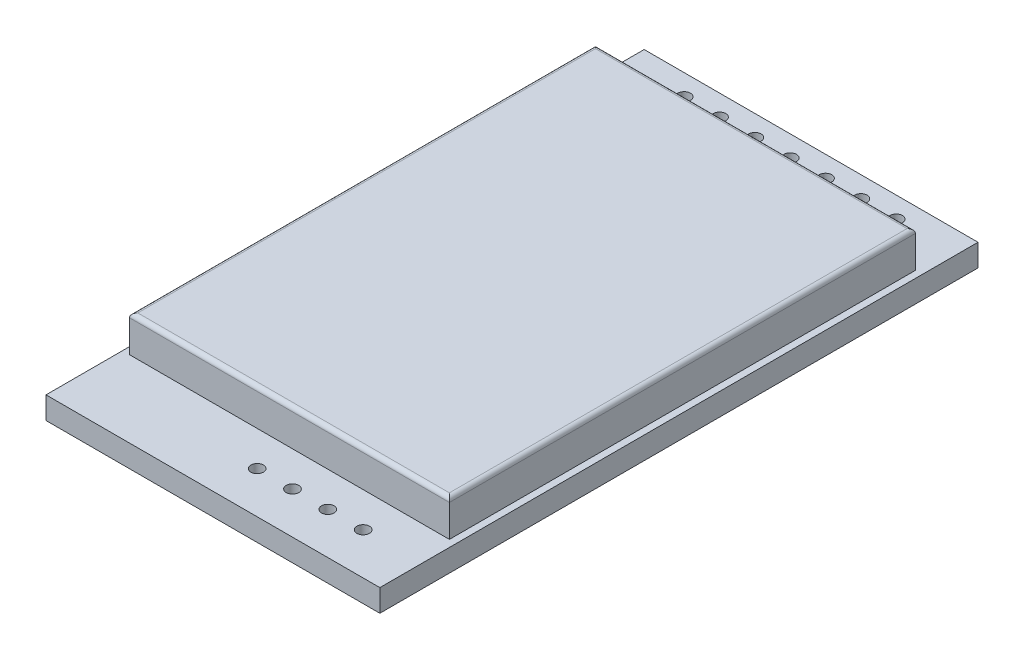
ISO-10303-21;
HEADER;
FILE_DESCRIPTION(('STEP AP214'),'2;1');
FILE_NAME('part.step','',(''),(''),'','','');
FILE_SCHEMA(('AUTOMOTIVE_DESIGN { 1 0 10303 214 1 1 1 1 }'));
ENDSEC;
DATA;
#1=APPLICATION_CONTEXT('core data for automotive mechanical design processes');
#2=APPLICATION_PROTOCOL_DEFINITION('international standard','automotive_design',2000,#1);
#3=PRODUCT_CONTEXT('',#1,'mechanical');
#4=PRODUCT('Part','Part','',(#3));
#5=PRODUCT_RELATED_PRODUCT_CATEGORY('part','',(#4));
#6=PRODUCT_DEFINITION_FORMATION('','',#4);
#7=PRODUCT_DEFINITION_CONTEXT('part definition',#1,'design');
#8=PRODUCT_DEFINITION('design','',#6,#7);
#9=PRODUCT_DEFINITION_SHAPE('','',#8);
#10=(LENGTH_UNIT() NAMED_UNIT(*) SI_UNIT(.MILLI.,.METRE.));
#11=(NAMED_UNIT(*) PLANE_ANGLE_UNIT() SI_UNIT($,.RADIAN.));
#12=(NAMED_UNIT(*) SI_UNIT($,.STERADIAN.) SOLID_ANGLE_UNIT());
#13=UNCERTAINTY_MEASURE_WITH_UNIT(LENGTH_MEASURE(1.E-05),#10,'distance_accuracy_value','');
#14=(GEOMETRIC_REPRESENTATION_CONTEXT(3) GLOBAL_UNCERTAINTY_ASSIGNED_CONTEXT((#13)) GLOBAL_UNIT_ASSIGNED_CONTEXT((#10,
#11,#12)) REPRESENTATION_CONTEXT('',''));
#15=CARTESIAN_POINT('',(0.,0.,0.));
#16=DIRECTION('',(0.,0.,1.));
#17=DIRECTION('',(1.,0.,0.));
#18=AXIS2_PLACEMENT_3D('',#15,#16,#17);
#19=CARTESIAN_POINT('',(0.,1.6,0.));
#20=DIRECTION('',(0.,-1.,0.));
#21=DIRECTION('',(0.,0.,-1.));
#22=AXIS2_PLACEMENT_3D('',#19,#20,#21);
#23=PLANE('',#22);
#24=CARTESIAN_POINT('',(12.18,1.6,-3.));
#25=DIRECTION('',(0.,1.,0.));
#26=DIRECTION('',(0.,0.,1.));
#27=AXIS2_PLACEMENT_3D('',#24,#25,#26);
#28=CIRCLE('',#27,0.449999999999998);
#29=CARTESIAN_POINT('',(12.18,1.6,-2.55));
#30=VERTEX_POINT('',#29);
#31=EDGE_CURVE('E139',#30,#30,#28,.T.);
#32=ORIENTED_EDGE('',*,*,#31,.F.);
#33=EDGE_LOOP('',(#32));
#34=FACE_BOUND('',#33,.T.);
#35=CARTESIAN_POINT('',(14.72,1.6,-3.));
#36=DIRECTION('',(0.,1.,0.));
#37=DIRECTION('',(0.,0.,1.));
#38=AXIS2_PLACEMENT_3D('',#35,#36,#37);
#39=CIRCLE('',#38,0.449999999999998);
#40=CARTESIAN_POINT('',(14.72,1.6,-2.55));
#41=VERTEX_POINT('',#40);
#42=EDGE_CURVE('E145',#41,#41,#39,.T.);
#43=ORIENTED_EDGE('',*,*,#42,.F.);
#44=EDGE_LOOP('',(#43));
#45=FACE_BOUND('',#44,.T.);
#46=CARTESIAN_POINT('',(17.26,1.6,-3.));
#47=DIRECTION('',(0.,1.,0.));
#48=DIRECTION('',(0.,0.,1.));
#49=AXIS2_PLACEMENT_3D('',#46,#47,#48);
#50=CIRCLE('',#49,0.449999999999998);
#51=CARTESIAN_POINT('',(17.26,1.6,-2.55));
#52=VERTEX_POINT('',#51);
#53=EDGE_CURVE('E151',#52,#52,#50,.T.);
#54=ORIENTED_EDGE('',*,*,#53,.F.);
#55=EDGE_LOOP('',(#54));
#56=FACE_BOUND('',#55,.T.);
#57=CARTESIAN_POINT('',(19.8,1.6,-3.));
#58=DIRECTION('',(0.,1.,0.));
#59=DIRECTION('',(0.,0.,1.));
#60=AXIS2_PLACEMENT_3D('',#57,#58,#59);
#61=CIRCLE('',#60,0.449999999999998);
#62=CARTESIAN_POINT('',(19.8,1.6,-2.55));
#63=VERTEX_POINT('',#62);
#64=EDGE_CURVE('E157',#63,#63,#61,.T.);
#65=ORIENTED_EDGE('',*,*,#64,.F.);
#66=EDGE_LOOP('',(#65));
#67=FACE_BOUND('',#66,.T.);
#68=CARTESIAN_POINT('',(4.38000000000029,1.6,-41.4999999999999));
#69=DIRECTION('',(0.,1.,0.));
#70=DIRECTION('',(0.,0.,1.));
#71=AXIS2_PLACEMENT_3D('',#68,#69,#70);
#72=CIRCLE('',#71,0.449999999999724);
#73=CARTESIAN_POINT('',(4.38000000000029,1.6,-41.0500000000001));
#74=VERTEX_POINT('',#73);
#75=EDGE_CURVE('E163',#74,#74,#72,.T.);
#76=ORIENTED_EDGE('',*,*,#75,.F.);
#77=EDGE_LOOP('',(#76));
#78=FACE_BOUND('',#77,.T.);
#79=CARTESIAN_POINT('',(6.92000000000029,1.6,-41.4999999999999));
#80=DIRECTION('',(0.,1.,0.));
#81=DIRECTION('',(0.,0.,1.));
#82=AXIS2_PLACEMENT_3D('',#79,#80,#81);
#83=CIRCLE('',#82,0.44999999999973);
#84=CARTESIAN_POINT('',(6.92000000000029,1.6,-41.0500000000001));
#85=VERTEX_POINT('',#84);
#86=EDGE_CURVE('E169',#85,#85,#83,.T.);
#87=ORIENTED_EDGE('',*,*,#86,.F.);
#88=EDGE_LOOP('',(#87));
#89=FACE_BOUND('',#88,.T.);
#90=CARTESIAN_POINT('',(9.46,1.6,-41.4999999999999));
#91=DIRECTION('',(0.,1.,0.));
#92=DIRECTION('',(0.,0.,1.));
#93=AXIS2_PLACEMENT_3D('',#90,#91,#92);
#94=CIRCLE('',#93,0.449999999999998);
#95=CARTESIAN_POINT('',(9.46,1.6,-41.0499999999999));
#96=VERTEX_POINT('',#95);
#97=EDGE_CURVE('E175',#96,#96,#94,.T.);
#98=ORIENTED_EDGE('',*,*,#97,.F.);
#99=EDGE_LOOP('',(#98));
#100=FACE_BOUND('',#99,.T.);
#101=CARTESIAN_POINT('',(12.,1.6,-41.4999999999999));
#102=DIRECTION('',(0.,1.,0.));
#103=DIRECTION('',(0.,0.,1.));
#104=AXIS2_PLACEMENT_3D('',#101,#102,#103);
#105=CIRCLE('',#104,0.449999999999998);
#106=CARTESIAN_POINT('',(12.,1.6,-41.0499999999999));
#107=VERTEX_POINT('',#106);
#108=EDGE_CURVE('E181',#107,#107,#105,.T.);
#109=ORIENTED_EDGE('',*,*,#108,.F.);
#110=EDGE_LOOP('',(#109));
#111=FACE_BOUND('',#110,.T.);
#112=CARTESIAN_POINT('',(14.54,1.6,-41.5));
#113=DIRECTION('',(0.,1.,0.));
#114=DIRECTION('',(0.,0.,1.));
#115=AXIS2_PLACEMENT_3D('',#112,#113,#114);
#116=CIRCLE('',#115,0.449999999999998);
#117=CARTESIAN_POINT('',(14.54,1.6,-41.05));
#118=VERTEX_POINT('',#117);
#119=EDGE_CURVE('E187',#118,#118,#116,.T.);
#120=ORIENTED_EDGE('',*,*,#119,.F.);
#121=EDGE_LOOP('',(#120));
#122=FACE_BOUND('',#121,.T.);
#123=CARTESIAN_POINT('',(17.08,1.6,-41.5));
#124=DIRECTION('',(0.,1.,0.));
#125=DIRECTION('',(0.,0.,1.));
#126=AXIS2_PLACEMENT_3D('',#123,#124,#125);
#127=CIRCLE('',#126,0.449999999999998);
#128=CARTESIAN_POINT('',(17.08,1.6,-41.05));
#129=VERTEX_POINT('',#128);
#130=EDGE_CURVE('E193',#129,#129,#127,.T.);
#131=ORIENTED_EDGE('',*,*,#130,.F.);
#132=EDGE_LOOP('',(#131));
#133=FACE_BOUND('',#132,.T.);
#134=CARTESIAN_POINT('',(19.62,1.6,-41.5));
#135=DIRECTION('',(0.,1.,0.));
#136=DIRECTION('',(0.,0.,1.));
#137=AXIS2_PLACEMENT_3D('',#134,#135,#136);
#138=CIRCLE('',#137,0.449999999999998);
#139=CARTESIAN_POINT('',(19.62,1.6,-41.05));
#140=VERTEX_POINT('',#139);
#141=EDGE_CURVE('E199',#140,#140,#138,.T.);
#142=ORIENTED_EDGE('',*,*,#141,.F.);
#143=EDGE_LOOP('',(#142));
#144=FACE_BOUND('',#143,.T.);
#145=DIRECTION('',(0.,0.,1.));
#146=VECTOR('',#145,1.);
#147=CARTESIAN_POINT('',(0.,1.6,0.));
#148=LINE('',#147,#146);
#149=CARTESIAN_POINT('',(0.,1.6,-43.));
#150=VERTEX_POINT('',#149);
#151=CARTESIAN_POINT('',(0.,1.6,0.));
#152=VERTEX_POINT('',#151);
#153=EDGE_CURVE('E205',#150,#152,#148,.T.);
#154=ORIENTED_EDGE('',*,*,#153,.T.);
#155=DIRECTION('',(1.,0.,0.));
#156=VECTOR('',#155,1.);
#157=CARTESIAN_POINT('',(0.,1.6,0.));
#158=LINE('',#157,#156);
#159=CARTESIAN_POINT('',(24.,1.6,0.));
#160=VERTEX_POINT('',#159);
#161=EDGE_CURVE('E208',#152,#160,#158,.T.);
#162=ORIENTED_EDGE('',*,*,#161,.T.);
#163=DIRECTION('',(0.,0.,-1.));
#164=VECTOR('',#163,1.);
#165=CARTESIAN_POINT('',(24.,1.6,0.));
#166=LINE('',#165,#164);
#167=CARTESIAN_POINT('',(24.,1.6,-43.));
#168=VERTEX_POINT('',#167);
#169=EDGE_CURVE('E211',#160,#168,#166,.T.);
#170=ORIENTED_EDGE('',*,*,#169,.T.);
#171=DIRECTION('',(-1.,0.,0.));
#172=VECTOR('',#171,1.);
#173=CARTESIAN_POINT('',(0.,1.6,-43.));
#174=LINE('',#173,#172);
#175=EDGE_CURVE('E213',#168,#150,#174,.T.);
#176=ORIENTED_EDGE('',*,*,#175,.T.);
#177=EDGE_LOOP('',(#154,#162,#170,#176));
#178=FACE_BOUND('',#177,.T.);
#179=DIRECTION('',(0.,0.,1.));
#180=VECTOR('',#179,1.);
#181=CARTESIAN_POINT('',(0.5,1.6,-39.));
#182=LINE('',#181,#180);
#183=CARTESIAN_POINT('',(0.5,1.6,-39.));
#184=VERTEX_POINT('',#183);
#185=CARTESIAN_POINT('',(0.500000000000005,1.6,-5.49999999999999));
#186=VERTEX_POINT('',#185);
#187=EDGE_CURVE('E129',#184,#186,#182,.T.);
#188=ORIENTED_EDGE('',*,*,#187,.F.);
#189=DIRECTION('',(-1.,0.,0.));
#190=VECTOR('',#189,1.);
#191=CARTESIAN_POINT('',(0.5,1.6,-39.));
#192=LINE('',#191,#190);
#193=CARTESIAN_POINT('',(23.5,1.6,-39.));
#194=VERTEX_POINT('',#193);
#195=EDGE_CURVE('E126',#194,#184,#192,.T.);
#196=ORIENTED_EDGE('',*,*,#195,.F.);
#197=DIRECTION('',(0.,0.,-1.));
#198=VECTOR('',#197,1.);
#199=CARTESIAN_POINT('',(23.5,1.6,-39.));
#200=LINE('',#199,#198);
#201=CARTESIAN_POINT('',(23.5,1.6,-5.49999999999999));
#202=VERTEX_POINT('',#201);
#203=EDGE_CURVE('E114',#202,#194,#200,.T.);
#204=ORIENTED_EDGE('',*,*,#203,.F.);
#205=DIRECTION('',(1.,0.,0.));
#206=VECTOR('',#205,1.);
#207=CARTESIAN_POINT('',(0.500000000000005,1.6,-5.49999999999999));
#208=LINE('',#207,#206);
#209=EDGE_CURVE('E123',#186,#202,#208,.T.);
#210=ORIENTED_EDGE('',*,*,#209,.F.);
#211=EDGE_LOOP('',(#188,#196,#204,#210));
#212=FACE_BOUND('',#211,.T.);
#213=ADVANCED_FACE('F35',(#34,#45,#56,#67,#78,#89,#100,#111,#122,#133,#144,#178,#212),#23,.F.);
#214=CARTESIAN_POINT('',(0.,0.,0.));
#215=DIRECTION('',(0.,-1.,0.));
#216=DIRECTION('',(0.,0.,-1.));
#217=AXIS2_PLACEMENT_3D('',#214,#215,#216);
#218=PLANE('',#217);
#219=CARTESIAN_POINT('',(14.72,0.,-3.));
#220=DIRECTION('',(0.,1.,0.));
#221=DIRECTION('',(0.,0.,1.));
#222=AXIS2_PLACEMENT_3D('',#219,#220,#221);
#223=CIRCLE('',#222,0.449999999999998);
#224=CARTESIAN_POINT('',(14.72,0.,-2.55));
#225=VERTEX_POINT('',#224);
#226=EDGE_CURVE('E142',#225,#225,#223,.T.);
#227=ORIENTED_EDGE('',*,*,#226,.T.);
#228=EDGE_LOOP('',(#227));
#229=FACE_BOUND('',#228,.T.);
#230=CARTESIAN_POINT('',(19.8,0.,-3.));
#231=DIRECTION('',(0.,1.,0.));
#232=DIRECTION('',(0.,0.,1.));
#233=AXIS2_PLACEMENT_3D('',#230,#231,#232);
#234=CIRCLE('',#233,0.449999999999998);
#235=CARTESIAN_POINT('',(19.8,0.,-2.55));
#236=VERTEX_POINT('',#235);
#237=EDGE_CURVE('E154',#236,#236,#234,.T.);
#238=ORIENTED_EDGE('',*,*,#237,.T.);
#239=EDGE_LOOP('',(#238));
#240=FACE_BOUND('',#239,.T.);
#241=CARTESIAN_POINT('',(6.92000000000029,0.,-41.4999999999999));
#242=DIRECTION('',(0.,1.,0.));
#243=DIRECTION('',(0.,0.,1.));
#244=AXIS2_PLACEMENT_3D('',#241,#242,#243);
#245=CIRCLE('',#244,0.44999999999973);
#246=CARTESIAN_POINT('',(6.92000000000029,0.,-41.0500000000001));
#247=VERTEX_POINT('',#246);
#248=EDGE_CURVE('E166',#247,#247,#245,.T.);
#249=ORIENTED_EDGE('',*,*,#248,.T.);
#250=EDGE_LOOP('',(#249));
#251=FACE_BOUND('',#250,.T.);
#252=CARTESIAN_POINT('',(12.,0.,-41.4999999999999));
#253=DIRECTION('',(0.,1.,0.));
#254=DIRECTION('',(0.,0.,1.));
#255=AXIS2_PLACEMENT_3D('',#252,#253,#254);
#256=CIRCLE('',#255,0.449999999999998);
#257=CARTESIAN_POINT('',(12.,0.,-41.0499999999999));
#258=VERTEX_POINT('',#257);
#259=EDGE_CURVE('E178',#258,#258,#256,.T.);
#260=ORIENTED_EDGE('',*,*,#259,.T.);
#261=EDGE_LOOP('',(#260));
#262=FACE_BOUND('',#261,.T.);
#263=CARTESIAN_POINT('',(17.08,0.,-41.5));
#264=DIRECTION('',(0.,1.,0.));
#265=DIRECTION('',(0.,0.,1.));
#266=AXIS2_PLACEMENT_3D('',#263,#264,#265);
#267=CIRCLE('',#266,0.449999999999998);
#268=CARTESIAN_POINT('',(17.08,0.,-41.05));
#269=VERTEX_POINT('',#268);
#270=EDGE_CURVE('E190',#269,#269,#267,.T.);
#271=ORIENTED_EDGE('',*,*,#270,.T.);
#272=EDGE_LOOP('',(#271));
#273=FACE_BOUND('',#272,.T.);
#274=DIRECTION('',(0.,0.,1.));
#275=VECTOR('',#274,1.);
#276=CARTESIAN_POINT('',(0.,0.,0.));
#277=LINE('',#276,#275);
#278=CARTESIAN_POINT('',(0.,0.,-43.));
#279=VERTEX_POINT('',#278);
#280=CARTESIAN_POINT('',(0.,0.,0.));
#281=VERTEX_POINT('',#280);
#282=EDGE_CURVE('E202',#279,#281,#277,.T.);
#283=ORIENTED_EDGE('',*,*,#282,.F.);
#284=DIRECTION('',(-1.,0.,0.));
#285=VECTOR('',#284,1.);
#286=CARTESIAN_POINT('',(0.,0.,-43.));
#287=LINE('',#286,#285);
#288=CARTESIAN_POINT('',(24.,0.,-43.));
#289=VERTEX_POINT('',#288);
#290=EDGE_CURVE('E209',#289,#279,#287,.T.);
#291=ORIENTED_EDGE('',*,*,#290,.F.);
#292=DIRECTION('',(0.,0.,-1.));
#293=VECTOR('',#292,1.);
#294=CARTESIAN_POINT('',(24.,0.,0.));
#295=LINE('',#294,#293);
#296=CARTESIAN_POINT('',(24.,0.,0.));
#297=VERTEX_POINT('',#296);
#298=EDGE_CURVE('E220',#297,#289,#295,.T.);
#299=ORIENTED_EDGE('',*,*,#298,.F.);
#300=DIRECTION('',(1.,0.,0.));
#301=VECTOR('',#300,1.);
#302=CARTESIAN_POINT('',(0.,0.,0.));
#303=LINE('',#302,#301);
#304=EDGE_CURVE('E218',#281,#297,#303,.T.);
#305=ORIENTED_EDGE('',*,*,#304,.F.);
#306=EDGE_LOOP('',(#283,#291,#299,#305));
#307=FACE_BOUND('',#306,.T.);
#308=CARTESIAN_POINT('',(19.62,0.,-41.5));
#309=DIRECTION('',(0.,1.,0.));
#310=DIRECTION('',(0.,0.,1.));
#311=AXIS2_PLACEMENT_3D('',#308,#309,#310);
#312=CIRCLE('',#311,0.449999999999998);
#313=CARTESIAN_POINT('',(19.62,0.,-41.05));
#314=VERTEX_POINT('',#313);
#315=EDGE_CURVE('E196',#314,#314,#312,.T.);
#316=ORIENTED_EDGE('',*,*,#315,.T.);
#317=EDGE_LOOP('',(#316));
#318=FACE_BOUND('',#317,.T.);
#319=CARTESIAN_POINT('',(14.54,0.,-41.5));
#320=DIRECTION('',(0.,1.,0.));
#321=DIRECTION('',(0.,0.,1.));
#322=AXIS2_PLACEMENT_3D('',#319,#320,#321);
#323=CIRCLE('',#322,0.449999999999998);
#324=CARTESIAN_POINT('',(14.54,0.,-41.05));
#325=VERTEX_POINT('',#324);
#326=EDGE_CURVE('E184',#325,#325,#323,.T.);
#327=ORIENTED_EDGE('',*,*,#326,.T.);
#328=EDGE_LOOP('',(#327));
#329=FACE_BOUND('',#328,.T.);
#330=CARTESIAN_POINT('',(9.46,0.,-41.4999999999999));
#331=DIRECTION('',(0.,1.,0.));
#332=DIRECTION('',(0.,0.,1.));
#333=AXIS2_PLACEMENT_3D('',#330,#331,#332);
#334=CIRCLE('',#333,0.449999999999998);
#335=CARTESIAN_POINT('',(9.46,0.,-41.0499999999999));
#336=VERTEX_POINT('',#335);
#337=EDGE_CURVE('E172',#336,#336,#334,.T.);
#338=ORIENTED_EDGE('',*,*,#337,.T.);
#339=EDGE_LOOP('',(#338));
#340=FACE_BOUND('',#339,.T.);
#341=CARTESIAN_POINT('',(4.38000000000029,0.,-41.4999999999999));
#342=DIRECTION('',(0.,1.,0.));
#343=DIRECTION('',(0.,0.,1.));
#344=AXIS2_PLACEMENT_3D('',#341,#342,#343);
#345=CIRCLE('',#344,0.449999999999724);
#346=CARTESIAN_POINT('',(4.38000000000029,0.,-41.0500000000001));
#347=VERTEX_POINT('',#346);
#348=EDGE_CURVE('E160',#347,#347,#345,.T.);
#349=ORIENTED_EDGE('',*,*,#348,.T.);
#350=EDGE_LOOP('',(#349));
#351=FACE_BOUND('',#350,.T.);
#352=CARTESIAN_POINT('',(17.26,0.,-3.));
#353=DIRECTION('',(0.,1.,0.));
#354=DIRECTION('',(0.,0.,1.));
#355=AXIS2_PLACEMENT_3D('',#352,#353,#354);
#356=CIRCLE('',#355,0.449999999999998);
#357=CARTESIAN_POINT('',(17.26,0.,-2.55));
#358=VERTEX_POINT('',#357);
#359=EDGE_CURVE('E148',#358,#358,#356,.T.);
#360=ORIENTED_EDGE('',*,*,#359,.T.);
#361=EDGE_LOOP('',(#360));
#362=FACE_BOUND('',#361,.T.);
#363=CARTESIAN_POINT('',(12.18,0.,-3.));
#364=DIRECTION('',(0.,1.,0.));
#365=DIRECTION('',(0.,0.,1.));
#366=AXIS2_PLACEMENT_3D('',#363,#364,#365);
#367=CIRCLE('',#366,0.449999999999998);
#368=CARTESIAN_POINT('',(12.18,0.,-2.55));
#369=VERTEX_POINT('',#368);
#370=EDGE_CURVE('E138',#369,#369,#367,.T.);
#371=ORIENTED_EDGE('',*,*,#370,.T.);
#372=EDGE_LOOP('',(#371));
#373=FACE_BOUND('',#372,.T.);
#374=ADVANCED_FACE('F286',(#229,#240,#251,#262,#273,#307,#318,#329,#340,#351,#362,#373),#218,.T.);
#375=CARTESIAN_POINT('',(0.,1.6,0.));
#376=DIRECTION('',(1.,0.,0.));
#377=DIRECTION('',(0.,0.,-1.));
#378=AXIS2_PLACEMENT_3D('',#375,#376,#377);
#379=PLANE('',#378);
#380=ORIENTED_EDGE('',*,*,#282,.T.);
#381=DIRECTION('',(0.,-1.,0.));
#382=VECTOR('',#381,1.);
#383=CARTESIAN_POINT('',(0.,1.6,0.));
#384=LINE('',#383,#382);
#385=EDGE_CURVE('E231',#152,#281,#384,.T.);
#386=ORIENTED_EDGE('',*,*,#385,.F.);
#387=ORIENTED_EDGE('',*,*,#153,.F.);
#388=DIRECTION('',(0.,-1.,0.));
#389=VECTOR('',#388,1.);
#390=CARTESIAN_POINT('',(0.,1.6,-43.));
#391=LINE('',#390,#389);
#392=EDGE_CURVE('E215',#150,#279,#391,.T.);
#393=ORIENTED_EDGE('',*,*,#392,.T.);
#394=EDGE_LOOP('',(#380,#386,#387,#393));
#395=FACE_BOUND('',#394,.T.);
#396=ADVANCED_FACE('F292',(#395),#379,.F.);
#397=CARTESIAN_POINT('',(0.,1.6,0.));
#398=DIRECTION('',(0.,0.,-1.));
#399=DIRECTION('',(-1.,0.,0.));
#400=AXIS2_PLACEMENT_3D('',#397,#398,#399);
#401=PLANE('',#400);
#402=ORIENTED_EDGE('',*,*,#304,.T.);
#403=DIRECTION('',(0.,-1.,0.));
#404=VECTOR('',#403,1.);
#405=CARTESIAN_POINT('',(24.,1.6,0.));
#406=LINE('',#405,#404);
#407=EDGE_CURVE('E228',#160,#297,#406,.T.);
#408=ORIENTED_EDGE('',*,*,#407,.F.);
#409=ORIENTED_EDGE('',*,*,#161,.F.);
#410=ORIENTED_EDGE('',*,*,#385,.T.);
#411=EDGE_LOOP('',(#402,#408,#409,#410));
#412=FACE_BOUND('',#411,.T.);
#413=ADVANCED_FACE('F308',(#412),#401,.F.);
#414=CARTESIAN_POINT('',(24.,1.6,0.));
#415=DIRECTION('',(-1.,0.,0.));
#416=DIRECTION('',(0.,0.,1.));
#417=AXIS2_PLACEMENT_3D('',#414,#415,#416);
#418=PLANE('',#417);
#419=ORIENTED_EDGE('',*,*,#298,.T.);
#420=DIRECTION('',(0.,-1.,0.));
#421=VECTOR('',#420,1.);
#422=CARTESIAN_POINT('',(24.,1.6,-43.));
#423=LINE('',#422,#421);
#424=EDGE_CURVE('E225',#168,#289,#423,.T.);
#425=ORIENTED_EDGE('',*,*,#424,.F.);
#426=ORIENTED_EDGE('',*,*,#169,.F.);
#427=ORIENTED_EDGE('',*,*,#407,.T.);
#428=EDGE_LOOP('',(#419,#425,#426,#427));
#429=FACE_BOUND('',#428,.T.);
#430=ADVANCED_FACE('F304',(#429),#418,.F.);
#431=CARTESIAN_POINT('',(0.,1.6,-43.));
#432=DIRECTION('',(0.,0.,1.));
#433=DIRECTION('',(1.,0.,0.));
#434=AXIS2_PLACEMENT_3D('',#431,#432,#433);
#435=PLANE('',#434);
#436=ORIENTED_EDGE('',*,*,#290,.T.);
#437=ORIENTED_EDGE('',*,*,#392,.F.);
#438=ORIENTED_EDGE('',*,*,#175,.F.);
#439=ORIENTED_EDGE('',*,*,#424,.T.);
#440=EDGE_LOOP('',(#436,#437,#438,#439));
#441=FACE_BOUND('',#440,.T.);
#442=ADVANCED_FACE('F301',(#441),#435,.F.);
#443=CARTESIAN_POINT('',(19.62,1.6,-41.5));
#444=DIRECTION('',(0.,-1.,0.));
#445=DIRECTION('',(0.,0.,-1.));
#446=AXIS2_PLACEMENT_3D('',#443,#444,#445);
#447=CYLINDRICAL_SURFACE('',#446,0.449999999999998);
#448=ORIENTED_EDGE('',*,*,#141,.T.);
#449=EDGE_LOOP('',(#448));
#450=FACE_BOUND('',#449,.T.);
#451=ORIENTED_EDGE('',*,*,#315,.F.);
#452=EDGE_LOOP('',(#451));
#453=FACE_BOUND('',#452,.T.);
#454=ADVANCED_FACE('F298',(#450,#453),#447,.F.);
#455=CARTESIAN_POINT('',(17.08,1.6,-41.5));
#456=DIRECTION('',(0.,-1.,0.));
#457=DIRECTION('',(0.,0.,-1.));
#458=AXIS2_PLACEMENT_3D('',#455,#456,#457);
#459=CYLINDRICAL_SURFACE('',#458,0.449999999999998);
#460=ORIENTED_EDGE('',*,*,#130,.T.);
#461=EDGE_LOOP('',(#460));
#462=FACE_BOUND('',#461,.T.);
#463=ORIENTED_EDGE('',*,*,#270,.F.);
#464=EDGE_LOOP('',(#463));
#465=FACE_BOUND('',#464,.T.);
#466=ADVANCED_FACE('F457',(#462,#465),#459,.F.);
#467=CARTESIAN_POINT('',(14.54,1.6,-41.5));
#468=DIRECTION('',(0.,-1.,0.));
#469=DIRECTION('',(0.,0.,-1.));
#470=AXIS2_PLACEMENT_3D('',#467,#468,#469);
#471=CYLINDRICAL_SURFACE('',#470,0.449999999999998);
#472=ORIENTED_EDGE('',*,*,#119,.T.);
#473=EDGE_LOOP('',(#472));
#474=FACE_BOUND('',#473,.T.);
#475=ORIENTED_EDGE('',*,*,#326,.F.);
#476=EDGE_LOOP('',(#475));
#477=FACE_BOUND('',#476,.T.);
#478=ADVANCED_FACE('F448',(#474,#477),#471,.F.);
#479=CARTESIAN_POINT('',(12.,1.6,-41.4999999999999));
#480=DIRECTION('',(0.,-1.,0.));
#481=DIRECTION('',(0.,0.,-1.));
#482=AXIS2_PLACEMENT_3D('',#479,#480,#481);
#483=CYLINDRICAL_SURFACE('',#482,0.449999999999998);
#484=ORIENTED_EDGE('',*,*,#108,.T.);
#485=EDGE_LOOP('',(#484));
#486=FACE_BOUND('',#485,.T.);
#487=ORIENTED_EDGE('',*,*,#259,.F.);
#488=EDGE_LOOP('',(#487));
#489=FACE_BOUND('',#488,.T.);
#490=ADVANCED_FACE('F439',(#486,#489),#483,.F.);
#491=CARTESIAN_POINT('',(9.46,1.6,-41.4999999999999));
#492=DIRECTION('',(0.,-1.,0.));
#493=DIRECTION('',(0.,0.,-1.));
#494=AXIS2_PLACEMENT_3D('',#491,#492,#493);
#495=CYLINDRICAL_SURFACE('',#494,0.449999999999998);
#496=ORIENTED_EDGE('',*,*,#97,.T.);
#497=EDGE_LOOP('',(#496));
#498=FACE_BOUND('',#497,.T.);
#499=ORIENTED_EDGE('',*,*,#337,.F.);
#500=EDGE_LOOP('',(#499));
#501=FACE_BOUND('',#500,.T.);
#502=ADVANCED_FACE('F430',(#498,#501),#495,.F.);
#503=CARTESIAN_POINT('',(6.92000000000029,1.6,-41.4999999999999));
#504=DIRECTION('',(0.,-1.,0.));
#505=DIRECTION('',(0.,0.,-1.));
#506=AXIS2_PLACEMENT_3D('',#503,#504,#505);
#507=CYLINDRICAL_SURFACE('',#506,0.44999999999973);
#508=ORIENTED_EDGE('',*,*,#86,.T.);
#509=EDGE_LOOP('',(#508));
#510=FACE_BOUND('',#509,.T.);
#511=ORIENTED_EDGE('',*,*,#248,.F.);
#512=EDGE_LOOP('',(#511));
#513=FACE_BOUND('',#512,.T.);
#514=ADVANCED_FACE('F421',(#510,#513),#507,.F.);
#515=CARTESIAN_POINT('',(4.38000000000029,1.6,-41.4999999999999));
#516=DIRECTION('',(0.,-1.,0.));
#517=DIRECTION('',(0.,0.,-1.));
#518=AXIS2_PLACEMENT_3D('',#515,#516,#517);
#519=CYLINDRICAL_SURFACE('',#518,0.449999999999724);
#520=ORIENTED_EDGE('',*,*,#75,.T.);
#521=EDGE_LOOP('',(#520));
#522=FACE_BOUND('',#521,.T.);
#523=ORIENTED_EDGE('',*,*,#348,.F.);
#524=EDGE_LOOP('',(#523));
#525=FACE_BOUND('',#524,.T.);
#526=ADVANCED_FACE('F412',(#522,#525),#519,.F.);
#527=CARTESIAN_POINT('',(19.8,1.6,-3.));
#528=DIRECTION('',(0.,-1.,0.));
#529=DIRECTION('',(0.,0.,-1.));
#530=AXIS2_PLACEMENT_3D('',#527,#528,#529);
#531=CYLINDRICAL_SURFACE('',#530,0.449999999999998);
#532=ORIENTED_EDGE('',*,*,#64,.T.);
#533=EDGE_LOOP('',(#532));
#534=FACE_BOUND('',#533,.T.);
#535=ORIENTED_EDGE('',*,*,#237,.F.);
#536=EDGE_LOOP('',(#535));
#537=FACE_BOUND('',#536,.T.);
#538=ADVANCED_FACE('F403',(#534,#537),#531,.F.);
#539=CARTESIAN_POINT('',(17.26,1.6,-3.));
#540=DIRECTION('',(0.,-1.,0.));
#541=DIRECTION('',(0.,0.,-1.));
#542=AXIS2_PLACEMENT_3D('',#539,#540,#541);
#543=CYLINDRICAL_SURFACE('',#542,0.449999999999998);
#544=ORIENTED_EDGE('',*,*,#53,.T.);
#545=EDGE_LOOP('',(#544));
#546=FACE_BOUND('',#545,.T.);
#547=ORIENTED_EDGE('',*,*,#359,.F.);
#548=EDGE_LOOP('',(#547));
#549=FACE_BOUND('',#548,.T.);
#550=ADVANCED_FACE('F394',(#546,#549),#543,.F.);
#551=CARTESIAN_POINT('',(14.72,1.6,-3.));
#552=DIRECTION('',(0.,-1.,0.));
#553=DIRECTION('',(0.,0.,-1.));
#554=AXIS2_PLACEMENT_3D('',#551,#552,#553);
#555=CYLINDRICAL_SURFACE('',#554,0.449999999999998);
#556=ORIENTED_EDGE('',*,*,#42,.T.);
#557=EDGE_LOOP('',(#556));
#558=FACE_BOUND('',#557,.T.);
#559=ORIENTED_EDGE('',*,*,#226,.F.);
#560=EDGE_LOOP('',(#559));
#561=FACE_BOUND('',#560,.T.);
#562=ADVANCED_FACE('F385',(#558,#561),#555,.F.);
#563=CARTESIAN_POINT('',(12.18,1.6,-3.));
#564=DIRECTION('',(0.,-1.,0.));
#565=DIRECTION('',(0.,0.,-1.));
#566=AXIS2_PLACEMENT_3D('',#563,#564,#565);
#567=CYLINDRICAL_SURFACE('',#566,0.449999999999998);
#568=ORIENTED_EDGE('',*,*,#31,.T.);
#569=EDGE_LOOP('',(#568));
#570=FACE_BOUND('',#569,.T.);
#571=ORIENTED_EDGE('',*,*,#370,.F.);
#572=EDGE_LOOP('',(#571));
#573=FACE_BOUND('',#572,.T.);
#574=ADVANCED_FACE('F373',(#570,#573),#567,.F.);
#575=CARTESIAN_POINT('',(0.5,4.2,-39.));
#576=DIRECTION('',(1.,0.,0.));
#577=DIRECTION('',(0.,0.,-1.));
#578=AXIS2_PLACEMENT_3D('',#575,#576,#577);
#579=PLANE('',#578);
#580=DIRECTION('',(0.,-1.,0.));
#581=VECTOR('',#580,1.);
#582=CARTESIAN_POINT('',(0.500000000000005,4.2,-5.49999999999999));
#583=LINE('',#582,#581);
#584=CARTESIAN_POINT('',(0.500000000000005,3.9,-5.49999999999999));
#585=VERTEX_POINT('',#584);
#586=EDGE_CURVE('E116',#585,#186,#583,.T.);
#587=ORIENTED_EDGE('',*,*,#586,.F.);
#588=DIRECTION('',(0.,0.,1.));
#589=VECTOR('',#588,1.);
#590=CARTESIAN_POINT('',(0.5,3.9,-39.));
#591=LINE('',#590,#589);
#592=CARTESIAN_POINT('',(0.5,3.9,-39.));
#593=VERTEX_POINT('',#592);
#594=EDGE_CURVE('E11',#585,#593,#591,.F.);
#595=ORIENTED_EDGE('',*,*,#594,.T.);
#596=DIRECTION('',(0.,-1.,0.));
#597=VECTOR('',#596,1.);
#598=CARTESIAN_POINT('',(0.5,4.2,-39.));
#599=LINE('',#598,#597);
#600=EDGE_CURVE('E134',#593,#184,#599,.T.);
#601=ORIENTED_EDGE('',*,*,#600,.T.);
#602=ORIENTED_EDGE('',*,*,#187,.T.);
#603=EDGE_LOOP('',(#587,#595,#601,#602));
#604=FACE_BOUND('',#603,.T.);
#605=ADVANCED_FACE('F269',(#604),#579,.F.);
#606=CARTESIAN_POINT('',(0.500000000000005,4.2,-5.49999999999999));
#607=DIRECTION('',(0.,0.,-1.));
#608=DIRECTION('',(-1.,0.,0.));
#609=AXIS2_PLACEMENT_3D('',#606,#607,#608);
#610=PLANE('',#609);
#611=DIRECTION('',(0.,-1.,0.));
#612=VECTOR('',#611,1.);
#613=CARTESIAN_POINT('',(23.5,4.2,-5.49999999999999));
#614=LINE('',#613,#612);
#615=CARTESIAN_POINT('',(23.5,3.9,-5.49999999999999));
#616=VERTEX_POINT('',#615);
#617=EDGE_CURVE('E111',#616,#202,#614,.T.);
#618=ORIENTED_EDGE('',*,*,#617,.F.);
#619=DIRECTION('',(1.,0.,0.));
#620=VECTOR('',#619,1.);
#621=CARTESIAN_POINT('',(0.500000000000005,3.9,-5.49999999999999));
#622=LINE('',#621,#620);
#623=EDGE_CURVE('E44',#616,#585,#622,.F.);
#624=ORIENTED_EDGE('',*,*,#623,.T.);
#625=ORIENTED_EDGE('',*,*,#586,.T.);
#626=ORIENTED_EDGE('',*,*,#209,.T.);
#627=EDGE_LOOP('',(#618,#624,#625,#626));
#628=FACE_BOUND('',#627,.T.);
#629=ADVANCED_FACE('F128',(#628),#610,.F.);
#630=CARTESIAN_POINT('',(23.5,4.2,-39.));
#631=DIRECTION('',(-1.,0.,0.));
#632=DIRECTION('',(0.,0.,1.));
#633=AXIS2_PLACEMENT_3D('',#630,#631,#632);
#634=PLANE('',#633);
#635=DIRECTION('',(0.,-1.,0.));
#636=VECTOR('',#635,1.);
#637=CARTESIAN_POINT('',(23.5,4.2,-39.));
#638=LINE('',#637,#636);
#639=CARTESIAN_POINT('',(23.5,3.9,-39.));
#640=VERTEX_POINT('',#639);
#641=EDGE_CURVE('E117',#640,#194,#638,.T.);
#642=ORIENTED_EDGE('',*,*,#641,.F.);
#643=DIRECTION('',(0.,0.,-1.));
#644=VECTOR('',#643,1.);
#645=CARTESIAN_POINT('',(23.5,3.9,-5.49999999999999));
#646=LINE('',#645,#644);
#647=EDGE_CURVE('E59',#640,#616,#646,.F.);
#648=ORIENTED_EDGE('',*,*,#647,.T.);
#649=ORIENTED_EDGE('',*,*,#617,.T.);
#650=ORIENTED_EDGE('',*,*,#203,.T.);
#651=EDGE_LOOP('',(#642,#648,#649,#650));
#652=FACE_BOUND('',#651,.T.);
#653=ADVANCED_FACE('F113',(#652),#634,.F.);
#654=CARTESIAN_POINT('',(0.5,4.2,-39.));
#655=DIRECTION('',(0.,0.,1.));
#656=DIRECTION('',(1.,0.,0.));
#657=AXIS2_PLACEMENT_3D('',#654,#655,#656);
#658=PLANE('',#657);
#659=ORIENTED_EDGE('',*,*,#600,.F.);
#660=DIRECTION('',(-1.,0.,0.));
#661=VECTOR('',#660,1.);
#662=CARTESIAN_POINT('',(23.5,3.9,-39.));
#663=LINE('',#662,#661);
#664=EDGE_CURVE('E243',#593,#640,#663,.F.);
#665=ORIENTED_EDGE('',*,*,#664,.T.);
#666=ORIENTED_EDGE('',*,*,#641,.T.);
#667=ORIENTED_EDGE('',*,*,#195,.T.);
#668=EDGE_LOOP('',(#659,#665,#666,#667));
#669=FACE_BOUND('',#668,.T.);
#670=ADVANCED_FACE('F272',(#669),#658,.F.);
#671=CARTESIAN_POINT('',(0.,4.2,0.));
#672=DIRECTION('',(0.,1.,0.));
#673=DIRECTION('',(0.,0.,1.));
#674=AXIS2_PLACEMENT_3D('',#671,#672,#673);
#675=PLANE('',#674);
#676=DIRECTION('',(0.,0.,-1.));
#677=VECTOR('',#676,1.);
#678=CARTESIAN_POINT('',(23.2,4.2,-39.));
#679=LINE('',#678,#677);
#680=CARTESIAN_POINT('',(23.2,4.2,-5.79999999999999));
#681=VERTEX_POINT('',#680);
#682=CARTESIAN_POINT('',(23.2,4.2,-38.7));
#683=VERTEX_POINT('',#682);
#684=EDGE_CURVE('E238',#681,#683,#679,.T.);
#685=ORIENTED_EDGE('',*,*,#684,.T.);
#686=DIRECTION('',(-1.,0.,0.));
#687=VECTOR('',#686,1.);
#688=CARTESIAN_POINT('',(0.5,4.2,-38.7));
#689=LINE('',#688,#687);
#690=CARTESIAN_POINT('',(0.8,4.2,-38.7));
#691=VERTEX_POINT('',#690);
#692=EDGE_CURVE('E240',#683,#691,#689,.T.);
#693=ORIENTED_EDGE('',*,*,#692,.T.);
#694=DIRECTION('',(0.,0.,1.));
#695=VECTOR('',#694,1.);
#696=CARTESIAN_POINT('',(0.800000000000004,4.2,-5.49999999999999));
#697=LINE('',#696,#695);
#698=CARTESIAN_POINT('',(0.800000000000004,4.2,-5.79999999999999));
#699=VERTEX_POINT('',#698);
#700=EDGE_CURVE('E234',#691,#699,#697,.T.);
#701=ORIENTED_EDGE('',*,*,#700,.T.);
#702=DIRECTION('',(1.,0.,0.));
#703=VECTOR('',#702,1.);
#704=CARTESIAN_POINT('',(23.5,4.2,-5.79999999999999));
#705=LINE('',#704,#703);
#706=EDGE_CURVE('E236',#699,#681,#705,.T.);
#707=ORIENTED_EDGE('',*,*,#706,.T.);
#708=EDGE_LOOP('',(#685,#693,#701,#707));
#709=FACE_BOUND('',#708,.T.);
#710=ADVANCED_FACE('F277',(#709),#675,.T.);
#711=CARTESIAN_POINT('',(0.,3.9,-5.79999999999999));
#712=DIRECTION('',(-1.,0.,0.));
#713=DIRECTION('',(0.,0.,1.));
#714=AXIS2_PLACEMENT_3D('',#711,#712,#713);
#715=CYLINDRICAL_SURFACE('',#714,0.3);
#716=CARTESIAN_POINT('',(0.800000000000004,3.9,-5.79999999999999));
#717=DIRECTION('',(-0.707106781186548,0.,-0.707106781186547));
#718=DIRECTION('',(0.707106781186547,0.,-0.707106781186548));
#719=AXIS2_PLACEMENT_3D('',#716,#717,#718);
#720=ELLIPSE('',#719,0.424264068711928,0.3);
#721=EDGE_CURVE('E251',#585,#699,#720,.T.);
#722=ORIENTED_EDGE('',*,*,#721,.F.);
#723=ORIENTED_EDGE('',*,*,#623,.F.);
#724=CARTESIAN_POINT('',(23.2,3.9,-5.79999999999999));
#725=DIRECTION('',(-0.707106781186547,0.,0.707106781186548));
#726=DIRECTION('',(-0.707106781186547,0.,-0.707106781186547));
#727=AXIS2_PLACEMENT_3D('',#724,#725,#726);
#728=ELLIPSE('',#727,0.424264068711929,0.3);
#729=EDGE_CURVE('E39',#681,#616,#728,.F.);
#730=ORIENTED_EDGE('',*,*,#729,.F.);
#731=ORIENTED_EDGE('',*,*,#706,.F.);
#732=EDGE_LOOP('',(#722,#723,#730,#731));
#733=FACE_BOUND('',#732,.T.);
#734=ADVANCED_FACE('F37',(#733),#715,.T.);
#735=CARTESIAN_POINT('',(23.2,3.9,0.));
#736=DIRECTION('',(0.,0.,1.));
#737=DIRECTION('',(1.,0.,0.));
#738=AXIS2_PLACEMENT_3D('',#735,#736,#737);
#739=CYLINDRICAL_SURFACE('',#738,0.3);
#740=ORIENTED_EDGE('',*,*,#729,.T.);
#741=ORIENTED_EDGE('',*,*,#647,.F.);
#742=CARTESIAN_POINT('',(23.2,3.9,-38.7));
#743=DIRECTION('',(0.707106781186547,0.,0.707106781186547));
#744=DIRECTION('',(-0.707106781186547,0.,0.707106781186548));
#745=AXIS2_PLACEMENT_3D('',#742,#743,#744);
#746=ELLIPSE('',#745,0.424264068711928,0.3);
#747=EDGE_CURVE('E250',#683,#640,#746,.F.);
#748=ORIENTED_EDGE('',*,*,#747,.F.);
#749=ORIENTED_EDGE('',*,*,#684,.F.);
#750=EDGE_LOOP('',(#740,#741,#748,#749));
#751=FACE_BOUND('',#750,.T.);
#752=ADVANCED_FACE('F261',(#751),#739,.T.);
#753=CARTESIAN_POINT('',(0.800000000000005,3.9,0.));
#754=DIRECTION('',(0.,0.,-1.));
#755=DIRECTION('',(-1.,0.,0.));
#756=AXIS2_PLACEMENT_3D('',#753,#754,#755);
#757=CYLINDRICAL_SURFACE('',#756,0.3);
#758=ORIENTED_EDGE('',*,*,#721,.T.);
#759=ORIENTED_EDGE('',*,*,#700,.F.);
#760=CARTESIAN_POINT('',(0.8,3.9,-38.7));
#761=DIRECTION('',(0.707106781186547,0.,-0.707106781186548));
#762=DIRECTION('',(-0.707106781186548,0.,-0.707106781186547));
#763=AXIS2_PLACEMENT_3D('',#760,#761,#762);
#764=ELLIPSE('',#763,0.424264068711929,0.3);
#765=EDGE_CURVE('E248',#593,#691,#764,.T.);
#766=ORIENTED_EDGE('',*,*,#765,.F.);
#767=ORIENTED_EDGE('',*,*,#594,.F.);
#768=EDGE_LOOP('',(#758,#759,#766,#767));
#769=FACE_BOUND('',#768,.T.);
#770=ADVANCED_FACE('F266',(#769),#757,.T.);
#771=CARTESIAN_POINT('',(0.,3.9,-38.7));
#772=DIRECTION('',(1.,0.,0.));
#773=DIRECTION('',(0.,0.,-1.));
#774=AXIS2_PLACEMENT_3D('',#771,#772,#773);
#775=CYLINDRICAL_SURFACE('',#774,0.3);
#776=ORIENTED_EDGE('',*,*,#747,.T.);
#777=ORIENTED_EDGE('',*,*,#664,.F.);
#778=ORIENTED_EDGE('',*,*,#765,.T.);
#779=ORIENTED_EDGE('',*,*,#692,.F.);
#780=EDGE_LOOP('',(#776,#777,#778,#779));
#781=FACE_BOUND('',#780,.T.);
#782=ADVANCED_FACE('F274',(#781),#775,.T.);
#783=CLOSED_SHELL('',(#213,#374,#396,#413,#430,#442,#454,#466,#478,#490,#502,#514,#526,#538,
#550,#562,#574,#605,#629,#653,#670,#710,#734,#752,#770,#782));
#784=MANIFOLD_SOLID_BREP('B2',#783);
#785=ADVANCED_BREP_SHAPE_REPRESENTATION('',(#18,#784),#14);
#786=SHAPE_DEFINITION_REPRESENTATION(#9,#785);
ENDSEC;
END-ISO-10303-21;
